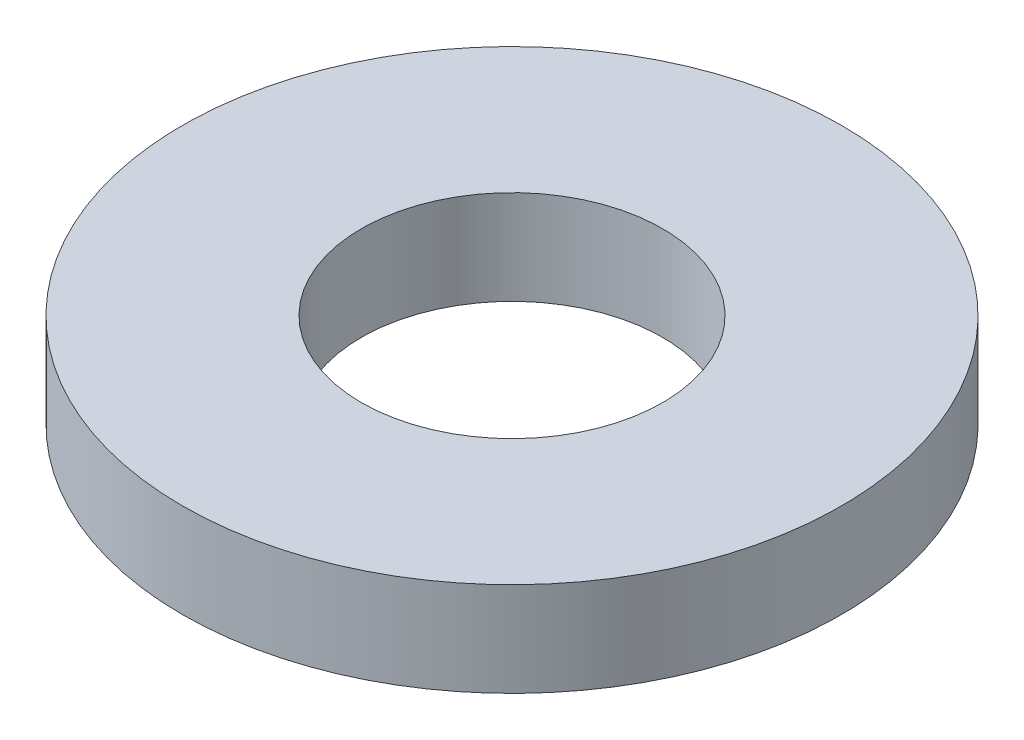
ISO-10303-21;
HEADER;
FILE_DESCRIPTION(('STEP AP214'),'2;1');
FILE_NAME('part.step','',(''),(''),'','','');
FILE_SCHEMA(('AUTOMOTIVE_DESIGN { 1 0 10303 214 1 1 1 1 }'));
ENDSEC;
DATA;
#1=APPLICATION_CONTEXT('core data for automotive mechanical design processes');
#2=APPLICATION_PROTOCOL_DEFINITION('international standard','automotive_design',2000,#1);
#3=PRODUCT_CONTEXT('',#1,'mechanical');
#4=PRODUCT('Part','Part','',(#3));
#5=PRODUCT_RELATED_PRODUCT_CATEGORY('part','',(#4));
#6=PRODUCT_DEFINITION_FORMATION('','',#4);
#7=PRODUCT_DEFINITION_CONTEXT('part definition',#1,'design');
#8=PRODUCT_DEFINITION('design','',#6,#7);
#9=PRODUCT_DEFINITION_SHAPE('','',#8);
#10=(LENGTH_UNIT() NAMED_UNIT(*) SI_UNIT(.MILLI.,.METRE.));
#11=(NAMED_UNIT(*) PLANE_ANGLE_UNIT() SI_UNIT($,.RADIAN.));
#12=(NAMED_UNIT(*) SI_UNIT($,.STERADIAN.) SOLID_ANGLE_UNIT());
#13=UNCERTAINTY_MEASURE_WITH_UNIT(LENGTH_MEASURE(1.E-05),#10,'distance_accuracy_value','');
#14=(GEOMETRIC_REPRESENTATION_CONTEXT(3) GLOBAL_UNCERTAINTY_ASSIGNED_CONTEXT((#13)) GLOBAL_UNIT_ASSIGNED_CONTEXT((#10,
#11,#12)) REPRESENTATION_CONTEXT('',''));
#15=CARTESIAN_POINT('',(0.,0.,0.));
#16=DIRECTION('',(0.,0.,1.));
#17=DIRECTION('',(1.,0.,0.));
#18=AXIS2_PLACEMENT_3D('',#15,#16,#17);
#19=CARTESIAN_POINT('',(0.,5.,0.));
#20=DIRECTION('',(0.,1.,0.));
#21=DIRECTION('',(0.,0.,1.));
#22=AXIS2_PLACEMENT_3D('',#19,#20,#21);
#23=PLANE('',#22);
#24=CARTESIAN_POINT('',(0.,5.,0.));
#25=DIRECTION('',(0.,1.,0.));
#26=DIRECTION('',(0.,0.,1.));
#27=AXIS2_PLACEMENT_3D('',#24,#25,#26);
#28=CIRCLE('',#27,17.5);
#29=CARTESIAN_POINT('',(0.,5.,17.5));
#30=VERTEX_POINT('',#29);
#31=EDGE_CURVE('E10',#30,#30,#28,.T.);
#32=ORIENTED_EDGE('',*,*,#31,.T.);
#33=EDGE_LOOP('',(#32));
#34=FACE_BOUND('',#33,.T.);
#35=CARTESIAN_POINT('',(0.,5.,0.));
#36=DIRECTION('',(0.,1.,0.));
#37=DIRECTION('',(0.,0.,1.));
#38=AXIS2_PLACEMENT_3D('',#35,#36,#37);
#39=CIRCLE('',#38,8.);
#40=CARTESIAN_POINT('',(0.,5.,8.));
#41=VERTEX_POINT('',#40);
#42=EDGE_CURVE('E54',#41,#41,#39,.T.);
#43=ORIENTED_EDGE('',*,*,#42,.F.);
#44=EDGE_LOOP('',(#43));
#45=FACE_BOUND('',#44,.T.);
#46=ADVANCED_FACE('F41',(#34,#45),#23,.T.);
#47=CARTESIAN_POINT('',(0.,0.,0.));
#48=DIRECTION('',(0.,1.,0.));
#49=DIRECTION('',(0.,0.,1.));
#50=AXIS2_PLACEMENT_3D('',#47,#48,#49);
#51=PLANE('',#50);
#52=CARTESIAN_POINT('',(0.,0.,0.));
#53=DIRECTION('',(0.,1.,0.));
#54=DIRECTION('',(0.,0.,1.));
#55=AXIS2_PLACEMENT_3D('',#52,#53,#54);
#56=CIRCLE('',#55,17.5);
#57=CARTESIAN_POINT('',(0.,0.,17.5));
#58=VERTEX_POINT('',#57);
#59=EDGE_CURVE('E45',#58,#58,#56,.T.);
#60=ORIENTED_EDGE('',*,*,#59,.F.);
#61=EDGE_LOOP('',(#60));
#62=FACE_BOUND('',#61,.T.);
#63=CARTESIAN_POINT('',(0.,0.,0.));
#64=DIRECTION('',(0.,1.,0.));
#65=DIRECTION('',(0.,0.,1.));
#66=AXIS2_PLACEMENT_3D('',#63,#64,#65);
#67=CIRCLE('',#66,8.);
#68=CARTESIAN_POINT('',(0.,0.,8.));
#69=VERTEX_POINT('',#68);
#70=EDGE_CURVE('E56',#69,#69,#67,.T.);
#71=ORIENTED_EDGE('',*,*,#70,.T.);
#72=EDGE_LOOP('',(#71));
#73=FACE_BOUND('',#72,.T.);
#74=ADVANCED_FACE('F68',(#62,#73),#51,.F.);
#75=CARTESIAN_POINT('',(0.,5.,0.));
#76=DIRECTION('',(0.,-1.,0.));
#77=DIRECTION('',(0.,0.,-1.));
#78=AXIS2_PLACEMENT_3D('',#75,#76,#77);
#79=CYLINDRICAL_SURFACE('',#78,17.5);
#80=ORIENTED_EDGE('',*,*,#31,.F.);
#81=EDGE_LOOP('',(#80));
#82=FACE_BOUND('',#81,.T.);
#83=ORIENTED_EDGE('',*,*,#59,.T.);
#84=EDGE_LOOP('',(#83));
#85=FACE_BOUND('',#84,.T.);
#86=ADVANCED_FACE('F43',(#82,#85),#79,.T.);
#87=CARTESIAN_POINT('',(0.,5.,0.));
#88=DIRECTION('',(0.,-1.,0.));
#89=DIRECTION('',(0.,0.,-1.));
#90=AXIS2_PLACEMENT_3D('',#87,#88,#89);
#91=CYLINDRICAL_SURFACE('',#90,8.);
#92=ORIENTED_EDGE('',*,*,#42,.T.);
#93=EDGE_LOOP('',(#92));
#94=FACE_BOUND('',#93,.T.);
#95=ORIENTED_EDGE('',*,*,#70,.F.);
#96=EDGE_LOOP('',(#95));
#97=FACE_BOUND('',#96,.T.);
#98=ADVANCED_FACE('F64',(#94,#97),#91,.F.);
#99=CLOSED_SHELL('',(#46,#74,#86,#98));
#100=MANIFOLD_SOLID_BREP('B2',#99);
#101=ADVANCED_BREP_SHAPE_REPRESENTATION('',(#18,#100),#14);
#102=SHAPE_DEFINITION_REPRESENTATION(#9,#101);
ENDSEC;
END-ISO-10303-21;
